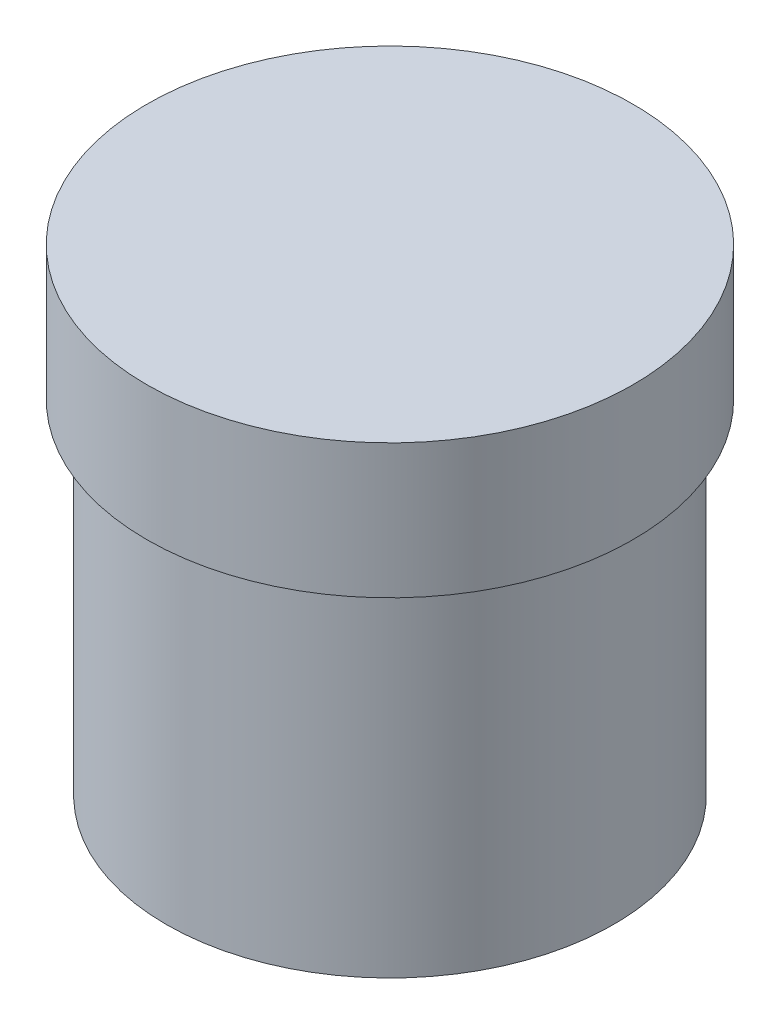
ISO-10303-21;
HEADER;
FILE_DESCRIPTION(('STEP AP214'),'2;1');
FILE_NAME('part.step','',(''),(''),'','','');
FILE_SCHEMA(('AUTOMOTIVE_DESIGN { 1 0 10303 214 1 1 1 1 }'));
ENDSEC;
DATA;
#1=APPLICATION_CONTEXT('core data for automotive mechanical design processes');
#2=APPLICATION_PROTOCOL_DEFINITION('international standard','automotive_design',2000,#1);
#3=PRODUCT_CONTEXT('',#1,'mechanical');
#4=PRODUCT('Part','Part','',(#3));
#5=PRODUCT_RELATED_PRODUCT_CATEGORY('part','',(#4));
#6=PRODUCT_DEFINITION_FORMATION('','',#4);
#7=PRODUCT_DEFINITION_CONTEXT('part definition',#1,'design');
#8=PRODUCT_DEFINITION('design','',#6,#7);
#9=PRODUCT_DEFINITION_SHAPE('','',#8);
#10=(LENGTH_UNIT() NAMED_UNIT(*) SI_UNIT(.MILLI.,.METRE.));
#11=(NAMED_UNIT(*) PLANE_ANGLE_UNIT() SI_UNIT($,.RADIAN.));
#12=(NAMED_UNIT(*) SI_UNIT($,.STERADIAN.) SOLID_ANGLE_UNIT());
#13=UNCERTAINTY_MEASURE_WITH_UNIT(LENGTH_MEASURE(1.E-05),#10,'distance_accuracy_value','');
#14=(GEOMETRIC_REPRESENTATION_CONTEXT(3) GLOBAL_UNCERTAINTY_ASSIGNED_CONTEXT((#13)) GLOBAL_UNIT_ASSIGNED_CONTEXT((#10,
#11,#12)) REPRESENTATION_CONTEXT('',''));
#15=CARTESIAN_POINT('',(0.,0.,0.));
#16=DIRECTION('',(0.,0.,1.));
#17=DIRECTION('',(1.,0.,0.));
#18=AXIS2_PLACEMENT_3D('',#15,#16,#17);
#19=CARTESIAN_POINT('',(0.,9.,0.));
#20=DIRECTION('',(0.,-1.,0.));
#21=DIRECTION('',(0.,0.,-1.));
#22=AXIS2_PLACEMENT_3D('',#19,#20,#21);
#23=CYLINDRICAL_SURFACE('',#22,16.3);
#24=CARTESIAN_POINT('',(0.,9.,0.));
#25=DIRECTION('',(0.,1.,0.));
#26=DIRECTION('',(0.,0.,1.));
#27=AXIS2_PLACEMENT_3D('',#24,#25,#26);
#28=CIRCLE('',#27,16.3);
#29=CARTESIAN_POINT('',(0.,9.,16.3));
#30=VERTEX_POINT('',#29);
#31=EDGE_CURVE('E10',#30,#30,#28,.T.);
#32=ORIENTED_EDGE('',*,*,#31,.F.);
#33=EDGE_LOOP('',(#32));
#34=FACE_BOUND('',#33,.T.);
#35=CARTESIAN_POINT('',(0.,0.,0.));
#36=DIRECTION('',(0.,1.,0.));
#37=DIRECTION('',(0.,0.,1.));
#38=AXIS2_PLACEMENT_3D('',#35,#36,#37);
#39=CIRCLE('',#38,16.3);
#40=CARTESIAN_POINT('',(0.,0.,16.3));
#41=VERTEX_POINT('',#40);
#42=EDGE_CURVE('E40',#41,#41,#39,.T.);
#43=ORIENTED_EDGE('',*,*,#42,.T.);
#44=EDGE_LOOP('',(#43));
#45=FACE_BOUND('',#44,.T.);
#46=ADVANCED_FACE('F37',(#34,#45),#23,.T.);
#47=CARTESIAN_POINT('',(0.,9.,0.));
#48=DIRECTION('',(0.,1.,0.));
#49=DIRECTION('',(0.,0.,1.));
#50=AXIS2_PLACEMENT_3D('',#47,#48,#49);
#51=PLANE('',#50);
#52=ORIENTED_EDGE('',*,*,#31,.T.);
#53=EDGE_LOOP('',(#52));
#54=FACE_BOUND('',#53,.T.);
#55=ADVANCED_FACE('F71',(#54),#51,.T.);
#56=CARTESIAN_POINT('',(0.,0.,0.));
#57=DIRECTION('',(0.,1.,0.));
#58=DIRECTION('',(0.,0.,1.));
#59=AXIS2_PLACEMENT_3D('',#56,#57,#58);
#60=PLANE('',#59);
#61=CARTESIAN_POINT('',(0.,0.,0.));
#62=DIRECTION('',(0.,1.,0.));
#63=DIRECTION('',(0.,0.,1.));
#64=AXIS2_PLACEMENT_3D('',#61,#62,#63);
#65=CIRCLE('',#64,15.);
#66=CARTESIAN_POINT('',(0.,0.,15.));
#67=VERTEX_POINT('',#66);
#68=EDGE_CURVE('E51',#67,#67,#65,.T.);
#69=ORIENTED_EDGE('',*,*,#68,.T.);
#70=EDGE_LOOP('',(#69));
#71=FACE_BOUND('',#70,.T.);
#72=ORIENTED_EDGE('',*,*,#42,.F.);
#73=EDGE_LOOP('',(#72));
#74=FACE_BOUND('',#73,.T.);
#75=ADVANCED_FACE('F68',(#71,#74),#60,.F.);
#76=CARTESIAN_POINT('',(0.,-23.,0.));
#77=DIRECTION('',(0.,1.,0.));
#78=DIRECTION('',(0.,0.,1.));
#79=AXIS2_PLACEMENT_3D('',#76,#77,#78);
#80=CYLINDRICAL_SURFACE('',#79,15.);
#81=CARTESIAN_POINT('',(0.,-23.,0.));
#82=DIRECTION('',(0.,1.,0.));
#83=DIRECTION('',(0.,0.,1.));
#84=AXIS2_PLACEMENT_3D('',#81,#82,#83);
#85=CIRCLE('',#84,15.);
#86=CARTESIAN_POINT('',(0.,-23.,15.));
#87=VERTEX_POINT('',#86);
#88=EDGE_CURVE('E49',#87,#87,#85,.T.);
#89=ORIENTED_EDGE('',*,*,#88,.T.);
#90=EDGE_LOOP('',(#89));
#91=FACE_BOUND('',#90,.T.);
#92=ORIENTED_EDGE('',*,*,#68,.F.);
#93=EDGE_LOOP('',(#92));
#94=FACE_BOUND('',#93,.T.);
#95=ADVANCED_FACE('F59',(#91,#94),#80,.T.);
#96=CARTESIAN_POINT('',(0.,-23.,0.));
#97=DIRECTION('',(0.,1.,0.));
#98=DIRECTION('',(0.,0.,1.));
#99=AXIS2_PLACEMENT_3D('',#96,#97,#98);
#100=PLANE('',#99);
#101=ORIENTED_EDGE('',*,*,#88,.F.);
#102=EDGE_LOOP('',(#101));
#103=FACE_BOUND('',#102,.T.);
#104=ADVANCED_FACE('F62',(#103),#100,.F.);
#105=CLOSED_SHELL('',(#46,#55,#75,#95,#104));
#106=MANIFOLD_SOLID_BREP('B2',#105);
#107=ADVANCED_BREP_SHAPE_REPRESENTATION('',(#18,#106),#14);
#108=SHAPE_DEFINITION_REPRESENTATION(#9,#107);
ENDSEC;
END-ISO-10303-21;
